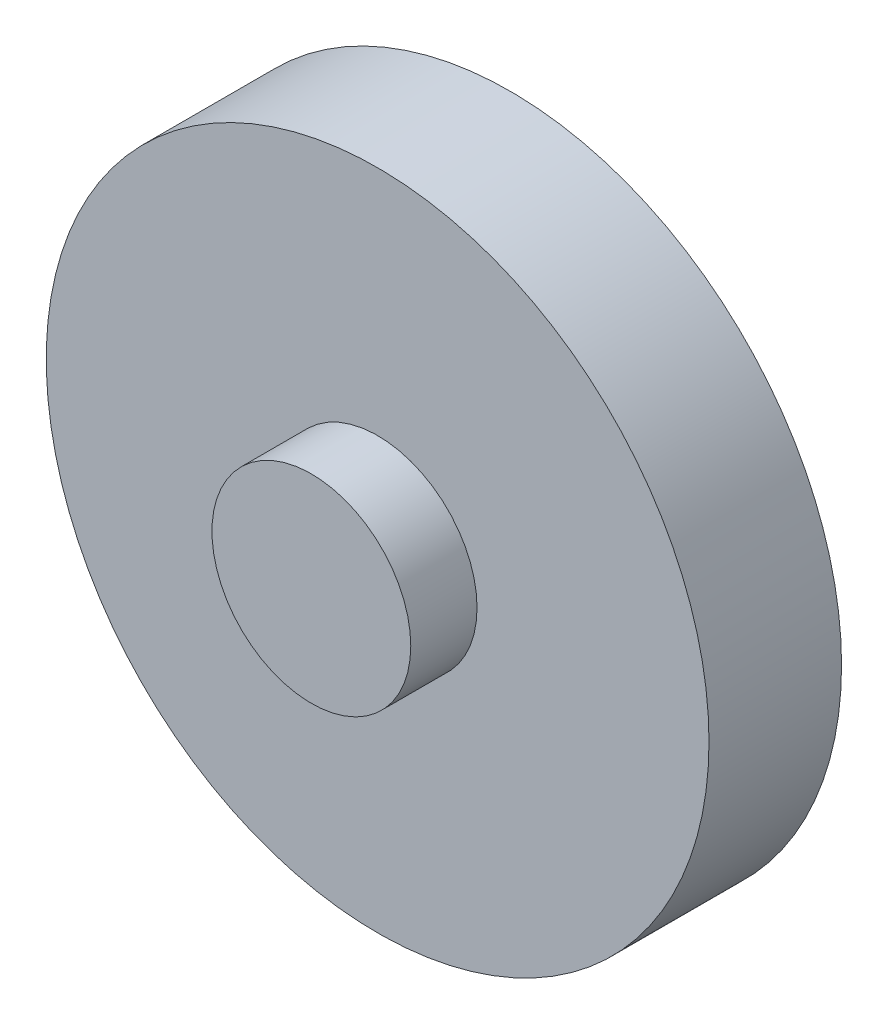
ISO-10303-21;
HEADER;
FILE_DESCRIPTION(('STEP AP214'),'2;1');
FILE_NAME('part.step','',(''),(''),'','','');
FILE_SCHEMA(('AUTOMOTIVE_DESIGN { 1 0 10303 214 1 1 1 1 }'));
ENDSEC;
DATA;
#1=APPLICATION_CONTEXT('core data for automotive mechanical design processes');
#2=APPLICATION_PROTOCOL_DEFINITION('international standard','automotive_design',2000,#1);
#3=PRODUCT_CONTEXT('',#1,'mechanical');
#4=PRODUCT('Part','Part','',(#3));
#5=PRODUCT_RELATED_PRODUCT_CATEGORY('part','',(#4));
#6=PRODUCT_DEFINITION_FORMATION('','',#4);
#7=PRODUCT_DEFINITION_CONTEXT('part definition',#1,'design');
#8=PRODUCT_DEFINITION('design','',#6,#7);
#9=PRODUCT_DEFINITION_SHAPE('','',#8);
#10=(LENGTH_UNIT() NAMED_UNIT(*) SI_UNIT(.MILLI.,.METRE.));
#11=(NAMED_UNIT(*) PLANE_ANGLE_UNIT() SI_UNIT($,.RADIAN.));
#12=(NAMED_UNIT(*) SI_UNIT($,.STERADIAN.) SOLID_ANGLE_UNIT());
#13=UNCERTAINTY_MEASURE_WITH_UNIT(LENGTH_MEASURE(1.E-05),#10,'distance_accuracy_value','');
#14=(GEOMETRIC_REPRESENTATION_CONTEXT(3) GLOBAL_UNCERTAINTY_ASSIGNED_CONTEXT((#13)) GLOBAL_UNIT_ASSIGNED_CONTEXT((#10,
#11,#12)) REPRESENTATION_CONTEXT('',''));
#15=CARTESIAN_POINT('',(0.,0.,0.));
#16=DIRECTION('',(0.,0.,1.));
#17=DIRECTION('',(1.,0.,0.));
#18=AXIS2_PLACEMENT_3D('',#15,#16,#17);
#19=CARTESIAN_POINT('',(0.,0.,20.));
#20=DIRECTION('',(0.,0.,-1.));
#21=DIRECTION('',(-1.,0.,0.));
#22=AXIS2_PLACEMENT_3D('',#19,#20,#21);
#23=CYLINDRICAL_SURFACE('',#22,50.);
#24=CARTESIAN_POINT('',(0.,0.,20.));
#25=DIRECTION('',(0.,0.,1.));
#26=DIRECTION('',(1.,0.,0.));
#27=AXIS2_PLACEMENT_3D('',#24,#25,#26);
#28=CIRCLE('',#27,50.);
#29=CARTESIAN_POINT('',(50.,0.,20.));
#30=VERTEX_POINT('',#29);
#31=EDGE_CURVE('E42',#30,#30,#28,.T.);
#32=ORIENTED_EDGE('',*,*,#31,.F.);
#33=EDGE_LOOP('',(#32));
#34=FACE_BOUND('',#33,.T.);
#35=CARTESIAN_POINT('',(0.,0.,0.));
#36=DIRECTION('',(0.,0.,1.));
#37=DIRECTION('',(1.,0.,0.));
#38=AXIS2_PLACEMENT_3D('',#35,#36,#37);
#39=CIRCLE('',#38,50.);
#40=CARTESIAN_POINT('',(50.,0.,0.));
#41=VERTEX_POINT('',#40);
#42=EDGE_CURVE('E37',#41,#41,#39,.T.);
#43=ORIENTED_EDGE('',*,*,#42,.T.);
#44=EDGE_LOOP('',(#43));
#45=FACE_BOUND('',#44,.T.);
#46=ADVANCED_FACE('F40',(#34,#45),#23,.T.);
#47=CARTESIAN_POINT('',(0.,0.,20.));
#48=DIRECTION('',(0.,0.,1.));
#49=DIRECTION('',(1.,0.,0.));
#50=AXIS2_PLACEMENT_3D('',#47,#48,#49);
#51=PLANE('',#50);
#52=CARTESIAN_POINT('',(0.,0.,20.));
#53=DIRECTION('',(0.,0.,1.));
#54=DIRECTION('',(1.,0.,0.));
#55=AXIS2_PLACEMENT_3D('',#52,#53,#54);
#56=CIRCLE('',#55,15.);
#57=CARTESIAN_POINT('',(15.,0.,20.));
#58=VERTEX_POINT('',#57);
#59=EDGE_CURVE('E10',#58,#58,#56,.T.);
#60=ORIENTED_EDGE('',*,*,#59,.F.);
#61=EDGE_LOOP('',(#60));
#62=FACE_BOUND('',#61,.T.);
#63=ORIENTED_EDGE('',*,*,#31,.T.);
#64=EDGE_LOOP('',(#63));
#65=FACE_BOUND('',#64,.T.);
#66=ADVANCED_FACE('F63',(#62,#65),#51,.T.);
#67=CARTESIAN_POINT('',(0.,0.,0.));
#68=DIRECTION('',(0.,0.,1.));
#69=DIRECTION('',(1.,0.,0.));
#70=AXIS2_PLACEMENT_3D('',#67,#68,#69);
#71=PLANE('',#70);
#72=ORIENTED_EDGE('',*,*,#42,.F.);
#73=EDGE_LOOP('',(#72));
#74=FACE_BOUND('',#73,.T.);
#75=ADVANCED_FACE('F59',(#74),#71,.F.);
#76=CARTESIAN_POINT('',(0.,0.,30.));
#77=DIRECTION('',(0.,0.,-1.));
#78=DIRECTION('',(-1.,0.,0.));
#79=AXIS2_PLACEMENT_3D('',#76,#77,#78);
#80=CYLINDRICAL_SURFACE('',#79,15.);
#81=CARTESIAN_POINT('',(0.,0.,30.));
#82=DIRECTION('',(0.,0.,1.));
#83=DIRECTION('',(1.,0.,0.));
#84=AXIS2_PLACEMENT_3D('',#81,#82,#83);
#85=CIRCLE('',#84,15.);
#86=CARTESIAN_POINT('',(15.,0.,30.));
#87=VERTEX_POINT('',#86);
#88=EDGE_CURVE('E49',#87,#87,#85,.T.);
#89=ORIENTED_EDGE('',*,*,#88,.F.);
#90=EDGE_LOOP('',(#89));
#91=FACE_BOUND('',#90,.T.);
#92=ORIENTED_EDGE('',*,*,#59,.T.);
#93=EDGE_LOOP('',(#92));
#94=FACE_BOUND('',#93,.T.);
#95=ADVANCED_FACE('F58',(#91,#94),#80,.T.);
#96=CARTESIAN_POINT('',(0.,0.,30.));
#97=DIRECTION('',(0.,0.,1.));
#98=DIRECTION('',(1.,0.,0.));
#99=AXIS2_PLACEMENT_3D('',#96,#97,#98);
#100=PLANE('',#99);
#101=ORIENTED_EDGE('',*,*,#88,.T.);
#102=EDGE_LOOP('',(#101));
#103=FACE_BOUND('',#102,.T.);
#104=ADVANCED_FACE('F70',(#103),#100,.T.);
#105=CLOSED_SHELL('',(#46,#66,#75,#95,#104));
#106=MANIFOLD_SOLID_BREP('B2',#105);
#107=ADVANCED_BREP_SHAPE_REPRESENTATION('',(#18,#106),#14);
#108=SHAPE_DEFINITION_REPRESENTATION(#9,#107);
ENDSEC;
END-ISO-10303-21;
